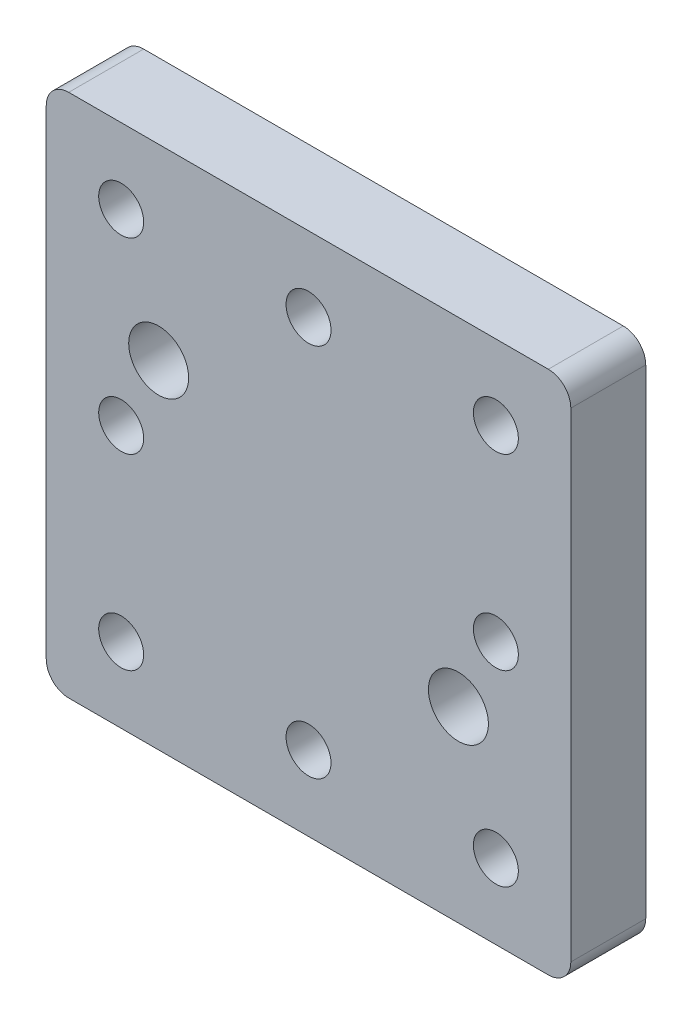
ISO-10303-21;
HEADER;
FILE_DESCRIPTION(('STEP AP214'),'2;1');
FILE_NAME('part.step','',(''),(''),'','','');
FILE_SCHEMA(('AUTOMOTIVE_DESIGN { 1 0 10303 214 1 1 1 1 }'));
ENDSEC;
DATA;
#1=APPLICATION_CONTEXT('core data for automotive mechanical design processes');
#2=APPLICATION_PROTOCOL_DEFINITION('international standard','automotive_design',2000,#1);
#3=PRODUCT_CONTEXT('',#1,'mechanical');
#4=PRODUCT('Part','Part','',(#3));
#5=PRODUCT_RELATED_PRODUCT_CATEGORY('part','',(#4));
#6=PRODUCT_DEFINITION_FORMATION('','',#4);
#7=PRODUCT_DEFINITION_CONTEXT('part definition',#1,'design');
#8=PRODUCT_DEFINITION('design','',#6,#7);
#9=PRODUCT_DEFINITION_SHAPE('','',#8);
#10=(LENGTH_UNIT() NAMED_UNIT(*) SI_UNIT(.MILLI.,.METRE.));
#11=(NAMED_UNIT(*) PLANE_ANGLE_UNIT() SI_UNIT($,.RADIAN.));
#12=(NAMED_UNIT(*) SI_UNIT($,.STERADIAN.) SOLID_ANGLE_UNIT());
#13=UNCERTAINTY_MEASURE_WITH_UNIT(LENGTH_MEASURE(1.E-05),#10,'distance_accuracy_value','');
#14=(GEOMETRIC_REPRESENTATION_CONTEXT(3) GLOBAL_UNCERTAINTY_ASSIGNED_CONTEXT((#13)) GLOBAL_UNIT_ASSIGNED_CONTEXT((#10,
#11,#12)) REPRESENTATION_CONTEXT('',''));
#15=CARTESIAN_POINT('',(0.,0.,0.));
#16=DIRECTION('',(0.,0.,1.));
#17=DIRECTION('',(1.,0.,0.));
#18=AXIS2_PLACEMENT_3D('',#15,#16,#17);
#19=CARTESIAN_POINT('',(35.,-35.,10.));
#20=DIRECTION('',(-1.,0.,0.));
#21=DIRECTION('',(0.,0.,1.));
#22=AXIS2_PLACEMENT_3D('',#19,#20,#21);
#23=PLANE('',#22);
#24=DIRECTION('',(0.,1.,0.));
#25=VECTOR('',#24,1.);
#26=CARTESIAN_POINT('',(35.,-35.,10.));
#27=LINE('',#26,#25);
#28=CARTESIAN_POINT('',(35.,-32.,10.));
#29=VERTEX_POINT('',#28);
#30=CARTESIAN_POINT('',(35.,32.,10.));
#31=VERTEX_POINT('',#30);
#32=EDGE_CURVE('E125',#29,#31,#27,.T.);
#33=ORIENTED_EDGE('',*,*,#32,.F.);
#34=DIRECTION('',(0.,0.,-1.));
#35=VECTOR('',#34,1.);
#36=CARTESIAN_POINT('',(35.,-32.,10.));
#37=LINE('',#36,#35);
#38=CARTESIAN_POINT('',(35.,-32.,0.));
#39=VERTEX_POINT('',#38);
#40=EDGE_CURVE('E151',#29,#39,#37,.T.);
#41=ORIENTED_EDGE('',*,*,#40,.T.);
#42=DIRECTION('',(0.,1.,0.));
#43=VECTOR('',#42,1.);
#44=CARTESIAN_POINT('',(35.,-35.,0.));
#45=LINE('',#44,#43);
#46=CARTESIAN_POINT('',(35.,32.,0.));
#47=VERTEX_POINT('',#46);
#48=EDGE_CURVE('E157',#39,#47,#45,.T.);
#49=ORIENTED_EDGE('',*,*,#48,.T.);
#50=DIRECTION('',(0.,0.,-1.));
#51=VECTOR('',#50,1.);
#52=CARTESIAN_POINT('',(35.,32.,10.));
#53=LINE('',#52,#51);
#54=EDGE_CURVE('E149',#47,#31,#53,.F.);
#55=ORIENTED_EDGE('',*,*,#54,.T.);
#56=EDGE_LOOP('',(#33,#41,#49,#55));
#57=FACE_BOUND('',#56,.T.);
#58=ADVANCED_FACE('F33',(#57),#23,.F.);
#59=CARTESIAN_POINT('',(-35.,35.,10.));
#60=DIRECTION('',(0.,-1.,0.));
#61=DIRECTION('',(0.,0.,-1.));
#62=AXIS2_PLACEMENT_3D('',#59,#60,#61);
#63=PLANE('',#62);
#64=DIRECTION('',(-1.,0.,0.));
#65=VECTOR('',#64,1.);
#66=CARTESIAN_POINT('',(-35.,35.,10.));
#67=LINE('',#66,#65);
#68=CARTESIAN_POINT('',(32.,35.,10.));
#69=VERTEX_POINT('',#68);
#70=CARTESIAN_POINT('',(-32.,35.,10.));
#71=VERTEX_POINT('',#70);
#72=EDGE_CURVE('E128',#69,#71,#67,.T.);
#73=ORIENTED_EDGE('',*,*,#72,.F.);
#74=DIRECTION('',(0.,0.,-1.));
#75=VECTOR('',#74,1.);
#76=CARTESIAN_POINT('',(32.,35.,10.));
#77=LINE('',#76,#75);
#78=CARTESIAN_POINT('',(32.,35.,0.));
#79=VERTEX_POINT('',#78);
#80=EDGE_CURVE('E11',#69,#79,#77,.T.);
#81=ORIENTED_EDGE('',*,*,#80,.T.);
#82=DIRECTION('',(-1.,0.,0.));
#83=VECTOR('',#82,1.);
#84=CARTESIAN_POINT('',(-35.,35.,0.));
#85=LINE('',#84,#83);
#86=CARTESIAN_POINT('',(-32.,35.,0.));
#87=VERTEX_POINT('',#86);
#88=EDGE_CURVE('E130',#79,#87,#85,.T.);
#89=ORIENTED_EDGE('',*,*,#88,.T.);
#90=DIRECTION('',(0.,0.,-1.));
#91=VECTOR('',#90,1.);
#92=CARTESIAN_POINT('',(-32.,35.,10.));
#93=LINE('',#92,#91);
#94=EDGE_CURVE('E41',#87,#71,#93,.F.);
#95=ORIENTED_EDGE('',*,*,#94,.T.);
#96=EDGE_LOOP('',(#73,#81,#89,#95));
#97=FACE_BOUND('',#96,.T.);
#98=ADVANCED_FACE('F276',(#97),#63,.F.);
#99=CARTESIAN_POINT('',(-35.,-35.,10.));
#100=DIRECTION('',(1.,0.,0.));
#101=DIRECTION('',(0.,0.,-1.));
#102=AXIS2_PLACEMENT_3D('',#99,#100,#101);
#103=PLANE('',#102);
#104=DIRECTION('',(0.,-1.,0.));
#105=VECTOR('',#104,1.);
#106=CARTESIAN_POINT('',(-35.,-35.,0.));
#107=LINE('',#106,#105);
#108=CARTESIAN_POINT('',(-35.,32.,0.));
#109=VERTEX_POINT('',#108);
#110=CARTESIAN_POINT('',(-35.,-32.,0.));
#111=VERTEX_POINT('',#110);
#112=EDGE_CURVE('E126',#109,#111,#107,.T.);
#113=ORIENTED_EDGE('',*,*,#112,.T.);
#114=DIRECTION('',(0.,0.,-1.));
#115=VECTOR('',#114,1.);
#116=CARTESIAN_POINT('',(-35.,-32.,10.));
#117=LINE('',#116,#115);
#118=CARTESIAN_POINT('',(-35.,-32.,10.));
#119=VERTEX_POINT('',#118);
#120=EDGE_CURVE('E104',#111,#119,#117,.F.);
#121=ORIENTED_EDGE('',*,*,#120,.T.);
#122=DIRECTION('',(0.,-1.,0.));
#123=VECTOR('',#122,1.);
#124=CARTESIAN_POINT('',(-35.,-35.,10.));
#125=LINE('',#124,#123);
#126=CARTESIAN_POINT('',(-35.,32.,10.));
#127=VERTEX_POINT('',#126);
#128=EDGE_CURVE('E169',#127,#119,#125,.T.);
#129=ORIENTED_EDGE('',*,*,#128,.F.);
#130=DIRECTION('',(0.,0.,-1.));
#131=VECTOR('',#130,1.);
#132=CARTESIAN_POINT('',(-35.,32.,10.));
#133=LINE('',#132,#131);
#134=EDGE_CURVE('E109',#127,#109,#133,.T.);
#135=ORIENTED_EDGE('',*,*,#134,.T.);
#136=EDGE_LOOP('',(#113,#121,#129,#135));
#137=FACE_BOUND('',#136,.T.);
#138=ADVANCED_FACE('F274',(#137),#103,.F.);
#139=CARTESIAN_POINT('',(-35.,-35.,10.));
#140=DIRECTION('',(0.,1.,0.));
#141=DIRECTION('',(0.,0.,1.));
#142=AXIS2_PLACEMENT_3D('',#139,#140,#141);
#143=PLANE('',#142);
#144=DIRECTION('',(1.,0.,0.));
#145=VECTOR('',#144,1.);
#146=CARTESIAN_POINT('',(-35.,-35.,10.));
#147=LINE('',#146,#145);
#148=CARTESIAN_POINT('',(-32.,-35.,10.));
#149=VERTEX_POINT('',#148);
#150=CARTESIAN_POINT('',(32.,-35.,10.));
#151=VERTEX_POINT('',#150);
#152=EDGE_CURVE('E119',#149,#151,#147,.T.);
#153=ORIENTED_EDGE('',*,*,#152,.F.);
#154=DIRECTION('',(0.,0.,-1.));
#155=VECTOR('',#154,1.);
#156=CARTESIAN_POINT('',(-32.,-35.,10.));
#157=LINE('',#156,#155);
#158=CARTESIAN_POINT('',(-32.,-35.,0.));
#159=VERTEX_POINT('',#158);
#160=EDGE_CURVE('E103',#149,#159,#157,.T.);
#161=ORIENTED_EDGE('',*,*,#160,.T.);
#162=DIRECTION('',(1.,0.,0.));
#163=VECTOR('',#162,1.);
#164=CARTESIAN_POINT('',(-35.,-35.,0.));
#165=LINE('',#164,#163);
#166=CARTESIAN_POINT('',(32.,-35.,0.));
#167=VERTEX_POINT('',#166);
#168=EDGE_CURVE('E116',#159,#167,#165,.T.);
#169=ORIENTED_EDGE('',*,*,#168,.T.);
#170=DIRECTION('',(0.,0.,-1.));
#171=VECTOR('',#170,1.);
#172=CARTESIAN_POINT('',(32.,-35.,10.));
#173=LINE('',#172,#171);
#174=EDGE_CURVE('E121',#167,#151,#173,.F.);
#175=ORIENTED_EDGE('',*,*,#174,.T.);
#176=EDGE_LOOP('',(#153,#161,#169,#175));
#177=FACE_BOUND('',#176,.T.);
#178=ADVANCED_FACE('F115',(#177),#143,.F.);
#179=CARTESIAN_POINT('',(0.,0.,10.));
#180=DIRECTION('',(0.,0.,-1.));
#181=DIRECTION('',(-1.,0.,0.));
#182=AXIS2_PLACEMENT_3D('',#179,#180,#181);
#183=PLANE('',#182);
#184=CARTESIAN_POINT('',(-20.,10.,10.));
#185=DIRECTION('',(0.,0.,-1.));
#186=DIRECTION('',(-1.,0.,0.));
#187=AXIS2_PLACEMENT_3D('',#184,#185,#186);
#188=CIRCLE('',#187,4.);
#189=CARTESIAN_POINT('',(-24.,10.,10.));
#190=VERTEX_POINT('',#189);
#191=EDGE_CURVE('E180',#190,#190,#188,.T.);
#192=ORIENTED_EDGE('',*,*,#191,.T.);
#193=EDGE_LOOP('',(#192));
#194=FACE_BOUND('',#193,.T.);
#195=CARTESIAN_POINT('',(20.,-10.,10.));
#196=DIRECTION('',(0.,0.,-1.));
#197=DIRECTION('',(-1.,0.,0.));
#198=AXIS2_PLACEMENT_3D('',#195,#196,#197);
#199=CIRCLE('',#198,4.);
#200=CARTESIAN_POINT('',(16.,-10.,10.));
#201=VERTEX_POINT('',#200);
#202=EDGE_CURVE('E218',#201,#201,#199,.T.);
#203=ORIENTED_EDGE('',*,*,#202,.T.);
#204=EDGE_LOOP('',(#203));
#205=FACE_BOUND('',#204,.T.);
#206=CARTESIAN_POINT('',(25.,-25.,10.));
#207=DIRECTION('',(0.,0.,1.));
#208=DIRECTION('',(1.,0.,0.));
#209=AXIS2_PLACEMENT_3D('',#206,#207,#208);
#210=CIRCLE('',#209,3.);
#211=CARTESIAN_POINT('',(28.,-25.,10.));
#212=VERTEX_POINT('',#211);
#213=EDGE_CURVE('E176',#212,#212,#210,.T.);
#214=ORIENTED_EDGE('',*,*,#213,.F.);
#215=EDGE_LOOP('',(#214));
#216=FACE_BOUND('',#215,.T.);
#217=CARTESIAN_POINT('',(0.,-25.,10.));
#218=DIRECTION('',(0.,0.,1.));
#219=DIRECTION('',(1.,0.,0.));
#220=AXIS2_PLACEMENT_3D('',#217,#218,#219);
#221=CIRCLE('',#220,3.);
#222=CARTESIAN_POINT('',(3.00000000000001,-25.,10.));
#223=VERTEX_POINT('',#222);
#224=EDGE_CURVE('E183',#223,#223,#221,.T.);
#225=ORIENTED_EDGE('',*,*,#224,.F.);
#226=EDGE_LOOP('',(#225));
#227=FACE_BOUND('',#226,.T.);
#228=CARTESIAN_POINT('',(-25.,-25.,10.));
#229=DIRECTION('',(0.,0.,1.));
#230=DIRECTION('',(1.,0.,0.));
#231=AXIS2_PLACEMENT_3D('',#228,#229,#230);
#232=CIRCLE('',#231,3.);
#233=CARTESIAN_POINT('',(-22.,-25.,10.));
#234=VERTEX_POINT('',#233);
#235=EDGE_CURVE('E189',#234,#234,#232,.T.);
#236=ORIENTED_EDGE('',*,*,#235,.F.);
#237=EDGE_LOOP('',(#236));
#238=FACE_BOUND('',#237,.T.);
#239=CARTESIAN_POINT('',(-25.,25.,10.));
#240=DIRECTION('',(0.,0.,1.));
#241=DIRECTION('',(1.,0.,0.));
#242=AXIS2_PLACEMENT_3D('',#239,#240,#241);
#243=CIRCLE('',#242,3.);
#244=CARTESIAN_POINT('',(-22.,25.,10.));
#245=VERTEX_POINT('',#244);
#246=EDGE_CURVE('E195',#245,#245,#243,.T.);
#247=ORIENTED_EDGE('',*,*,#246,.F.);
#248=EDGE_LOOP('',(#247));
#249=FACE_BOUND('',#248,.T.);
#250=CARTESIAN_POINT('',(-25.,0.,10.));
#251=DIRECTION('',(0.,0.,1.));
#252=DIRECTION('',(1.,0.,0.));
#253=AXIS2_PLACEMENT_3D('',#250,#251,#252);
#254=CIRCLE('',#253,3.);
#255=CARTESIAN_POINT('',(-22.,0.,10.));
#256=VERTEX_POINT('',#255);
#257=EDGE_CURVE('E201',#256,#256,#254,.T.);
#258=ORIENTED_EDGE('',*,*,#257,.F.);
#259=EDGE_LOOP('',(#258));
#260=FACE_BOUND('',#259,.T.);
#261=CARTESIAN_POINT('',(25.,0.,10.));
#262=DIRECTION('',(0.,0.,1.));
#263=DIRECTION('',(1.,0.,0.));
#264=AXIS2_PLACEMENT_3D('',#261,#262,#263);
#265=CIRCLE('',#264,3.);
#266=CARTESIAN_POINT('',(28.,0.,10.));
#267=VERTEX_POINT('',#266);
#268=EDGE_CURVE('E207',#267,#267,#265,.T.);
#269=ORIENTED_EDGE('',*,*,#268,.F.);
#270=EDGE_LOOP('',(#269));
#271=FACE_BOUND('',#270,.T.);
#272=CARTESIAN_POINT('',(25.,25.,10.));
#273=DIRECTION('',(0.,0.,1.));
#274=DIRECTION('',(1.,0.,0.));
#275=AXIS2_PLACEMENT_3D('',#272,#273,#274);
#276=CIRCLE('',#275,3.);
#277=CARTESIAN_POINT('',(28.,25.,10.));
#278=VERTEX_POINT('',#277);
#279=EDGE_CURVE('E213',#278,#278,#276,.T.);
#280=ORIENTED_EDGE('',*,*,#279,.F.);
#281=EDGE_LOOP('',(#280));
#282=FACE_BOUND('',#281,.T.);
#283=CARTESIAN_POINT('',(0.,25.,10.));
#284=DIRECTION('',(0.,0.,1.));
#285=DIRECTION('',(1.,0.,0.));
#286=AXIS2_PLACEMENT_3D('',#283,#284,#285);
#287=CIRCLE('',#286,3.);
#288=CARTESIAN_POINT('',(3.00000000000001,25.,10.));
#289=VERTEX_POINT('',#288);
#290=EDGE_CURVE('E165',#289,#289,#287,.T.);
#291=ORIENTED_EDGE('',*,*,#290,.F.);
#292=EDGE_LOOP('',(#291));
#293=FACE_BOUND('',#292,.T.);
#294=ORIENTED_EDGE('',*,*,#128,.T.);
#295=CARTESIAN_POINT('',(-32.,-32.,10.));
#296=DIRECTION('',(0.,0.,-1.));
#297=DIRECTION('',(-1.,0.,0.));
#298=AXIS2_PLACEMENT_3D('',#295,#296,#297);
#299=CIRCLE('',#298,3.);
#300=EDGE_CURVE('E147',#119,#149,#299,.F.);
#301=ORIENTED_EDGE('',*,*,#300,.T.);
#302=ORIENTED_EDGE('',*,*,#152,.T.);
#303=CARTESIAN_POINT('',(32.,-32.,10.));
#304=DIRECTION('',(0.,0.,-1.));
#305=DIRECTION('',(-1.,0.,0.));
#306=AXIS2_PLACEMENT_3D('',#303,#304,#305);
#307=CIRCLE('',#306,3.);
#308=EDGE_CURVE('E145',#151,#29,#307,.F.);
#309=ORIENTED_EDGE('',*,*,#308,.T.);
#310=ORIENTED_EDGE('',*,*,#32,.T.);
#311=CARTESIAN_POINT('',(32.,32.,10.));
#312=DIRECTION('',(0.,0.,-1.));
#313=DIRECTION('',(-1.,0.,0.));
#314=AXIS2_PLACEMENT_3D('',#311,#312,#313);
#315=CIRCLE('',#314,3.);
#316=EDGE_CURVE('E54',#31,#69,#315,.F.);
#317=ORIENTED_EDGE('',*,*,#316,.T.);
#318=ORIENTED_EDGE('',*,*,#72,.T.);
#319=CARTESIAN_POINT('',(-32.,32.,10.));
#320=DIRECTION('',(0.,0.,-1.));
#321=DIRECTION('',(-1.,0.,0.));
#322=AXIS2_PLACEMENT_3D('',#319,#320,#321);
#323=CIRCLE('',#322,3.);
#324=EDGE_CURVE('E142',#71,#127,#323,.F.);
#325=ORIENTED_EDGE('',*,*,#324,.T.);
#326=EDGE_LOOP('',(#294,#301,#302,#309,#310,#317,#318,#325));
#327=FACE_BOUND('',#326,.T.);
#328=ADVANCED_FACE('F230',(#194,#205,#216,#227,#238,#249,#260,#271,#282,#293,#327),#183,.F.);
#329=CARTESIAN_POINT('',(0.,0.,0.));
#330=DIRECTION('',(0.,0.,-1.));
#331=DIRECTION('',(-1.,0.,0.));
#332=AXIS2_PLACEMENT_3D('',#329,#330,#331);
#333=PLANE('',#332);
#334=CARTESIAN_POINT('',(-20.,10.,0.));
#335=DIRECTION('',(0.,0.,-1.));
#336=DIRECTION('',(-1.,0.,0.));
#337=AXIS2_PLACEMENT_3D('',#334,#335,#336);
#338=CIRCLE('',#337,4.);
#339=CARTESIAN_POINT('',(-24.,10.,0.));
#340=VERTEX_POINT('',#339);
#341=EDGE_CURVE('E224',#340,#340,#338,.T.);
#342=ORIENTED_EDGE('',*,*,#341,.F.);
#343=EDGE_LOOP('',(#342));
#344=FACE_BOUND('',#343,.T.);
#345=CARTESIAN_POINT('',(20.,-10.,0.));
#346=DIRECTION('',(0.,0.,-1.));
#347=DIRECTION('',(-1.,0.,0.));
#348=AXIS2_PLACEMENT_3D('',#345,#346,#347);
#349=CIRCLE('',#348,4.);
#350=CARTESIAN_POINT('',(16.,-10.,0.));
#351=VERTEX_POINT('',#350);
#352=EDGE_CURVE('E221',#351,#351,#349,.T.);
#353=ORIENTED_EDGE('',*,*,#352,.F.);
#354=EDGE_LOOP('',(#353));
#355=FACE_BOUND('',#354,.T.);
#356=CARTESIAN_POINT('',(25.,-25.,0.));
#357=DIRECTION('',(0.,0.,1.));
#358=DIRECTION('',(1.,0.,0.));
#359=AXIS2_PLACEMENT_3D('',#356,#357,#358);
#360=CIRCLE('',#359,3.);
#361=CARTESIAN_POINT('',(28.,-25.,0.));
#362=VERTEX_POINT('',#361);
#363=EDGE_CURVE('E179',#362,#362,#360,.T.);
#364=ORIENTED_EDGE('',*,*,#363,.T.);
#365=EDGE_LOOP('',(#364));
#366=FACE_BOUND('',#365,.T.);
#367=CARTESIAN_POINT('',(0.,-25.,0.));
#368=DIRECTION('',(0.,0.,1.));
#369=DIRECTION('',(1.,0.,0.));
#370=AXIS2_PLACEMENT_3D('',#367,#368,#369);
#371=CIRCLE('',#370,3.);
#372=CARTESIAN_POINT('',(3.00000000000001,-25.,0.));
#373=VERTEX_POINT('',#372);
#374=EDGE_CURVE('E186',#373,#373,#371,.T.);
#375=ORIENTED_EDGE('',*,*,#374,.T.);
#376=EDGE_LOOP('',(#375));
#377=FACE_BOUND('',#376,.T.);
#378=CARTESIAN_POINT('',(-25.,-25.,0.));
#379=DIRECTION('',(0.,0.,1.));
#380=DIRECTION('',(1.,0.,0.));
#381=AXIS2_PLACEMENT_3D('',#378,#379,#380);
#382=CIRCLE('',#381,3.);
#383=CARTESIAN_POINT('',(-22.,-25.,0.));
#384=VERTEX_POINT('',#383);
#385=EDGE_CURVE('E192',#384,#384,#382,.T.);
#386=ORIENTED_EDGE('',*,*,#385,.T.);
#387=EDGE_LOOP('',(#386));
#388=FACE_BOUND('',#387,.T.);
#389=CARTESIAN_POINT('',(-25.,25.,0.));
#390=DIRECTION('',(0.,0.,1.));
#391=DIRECTION('',(1.,0.,0.));
#392=AXIS2_PLACEMENT_3D('',#389,#390,#391);
#393=CIRCLE('',#392,3.);
#394=CARTESIAN_POINT('',(-22.,25.,0.));
#395=VERTEX_POINT('',#394);
#396=EDGE_CURVE('E198',#395,#395,#393,.T.);
#397=ORIENTED_EDGE('',*,*,#396,.T.);
#398=EDGE_LOOP('',(#397));
#399=FACE_BOUND('',#398,.T.);
#400=CARTESIAN_POINT('',(-25.,0.,0.));
#401=DIRECTION('',(0.,0.,1.));
#402=DIRECTION('',(1.,0.,0.));
#403=AXIS2_PLACEMENT_3D('',#400,#401,#402);
#404=CIRCLE('',#403,3.);
#405=CARTESIAN_POINT('',(-22.,0.,0.));
#406=VERTEX_POINT('',#405);
#407=EDGE_CURVE('E204',#406,#406,#404,.T.);
#408=ORIENTED_EDGE('',*,*,#407,.T.);
#409=EDGE_LOOP('',(#408));
#410=FACE_BOUND('',#409,.T.);
#411=CARTESIAN_POINT('',(25.,0.,0.));
#412=DIRECTION('',(0.,0.,1.));
#413=DIRECTION('',(1.,0.,0.));
#414=AXIS2_PLACEMENT_3D('',#411,#412,#413);
#415=CIRCLE('',#414,3.);
#416=CARTESIAN_POINT('',(28.,0.,0.));
#417=VERTEX_POINT('',#416);
#418=EDGE_CURVE('E210',#417,#417,#415,.T.);
#419=ORIENTED_EDGE('',*,*,#418,.T.);
#420=EDGE_LOOP('',(#419));
#421=FACE_BOUND('',#420,.T.);
#422=CARTESIAN_POINT('',(25.,25.,0.));
#423=DIRECTION('',(0.,0.,1.));
#424=DIRECTION('',(1.,0.,0.));
#425=AXIS2_PLACEMENT_3D('',#422,#423,#424);
#426=CIRCLE('',#425,3.);
#427=CARTESIAN_POINT('',(28.,25.,0.));
#428=VERTEX_POINT('',#427);
#429=EDGE_CURVE('E174',#428,#428,#426,.T.);
#430=ORIENTED_EDGE('',*,*,#429,.T.);
#431=EDGE_LOOP('',(#430));
#432=FACE_BOUND('',#431,.T.);
#433=CARTESIAN_POINT('',(0.,25.,0.));
#434=DIRECTION('',(0.,0.,1.));
#435=DIRECTION('',(1.,0.,0.));
#436=AXIS2_PLACEMENT_3D('',#433,#434,#435);
#437=CIRCLE('',#436,3.);
#438=CARTESIAN_POINT('',(3.00000000000001,25.,0.));
#439=VERTEX_POINT('',#438);
#440=EDGE_CURVE('E162',#439,#439,#437,.T.);
#441=ORIENTED_EDGE('',*,*,#440,.T.);
#442=EDGE_LOOP('',(#441));
#443=FACE_BOUND('',#442,.T.);
#444=ORIENTED_EDGE('',*,*,#168,.F.);
#445=CARTESIAN_POINT('',(-32.,-32.,0.));
#446=DIRECTION('',(0.,0.,-1.));
#447=DIRECTION('',(-1.,0.,0.));
#448=AXIS2_PLACEMENT_3D('',#445,#446,#447);
#449=CIRCLE('',#448,3.);
#450=EDGE_CURVE('E99',#159,#111,#449,.T.);
#451=ORIENTED_EDGE('',*,*,#450,.T.);
#452=ORIENTED_EDGE('',*,*,#112,.F.);
#453=CARTESIAN_POINT('',(-32.,32.,0.));
#454=DIRECTION('',(0.,0.,-1.));
#455=DIRECTION('',(-1.,0.,0.));
#456=AXIS2_PLACEMENT_3D('',#453,#454,#455);
#457=CIRCLE('',#456,3.);
#458=EDGE_CURVE('E120',#109,#87,#457,.T.);
#459=ORIENTED_EDGE('',*,*,#458,.T.);
#460=ORIENTED_EDGE('',*,*,#88,.F.);
#461=CARTESIAN_POINT('',(32.,32.,0.));
#462=DIRECTION('',(0.,0.,-1.));
#463=DIRECTION('',(-1.,0.,0.));
#464=AXIS2_PLACEMENT_3D('',#461,#462,#463);
#465=CIRCLE('',#464,3.);
#466=EDGE_CURVE('E136',#79,#47,#465,.T.);
#467=ORIENTED_EDGE('',*,*,#466,.T.);
#468=ORIENTED_EDGE('',*,*,#48,.F.);
#469=CARTESIAN_POINT('',(32.,-32.,0.));
#470=DIRECTION('',(0.,0.,-1.));
#471=DIRECTION('',(-1.,0.,0.));
#472=AXIS2_PLACEMENT_3D('',#469,#470,#471);
#473=CIRCLE('',#472,3.);
#474=EDGE_CURVE('E110',#39,#167,#473,.T.);
#475=ORIENTED_EDGE('',*,*,#474,.T.);
#476=EDGE_LOOP('',(#444,#451,#452,#459,#460,#467,#468,#475));
#477=FACE_BOUND('',#476,.T.);
#478=ADVANCED_FACE('F123',(#344,#355,#366,#377,#388,#399,#410,#421,#432,#443,#477),#333,.T.);
#479=CARTESIAN_POINT('',(0.,25.,0.));
#480=DIRECTION('',(0.,0.,1.));
#481=DIRECTION('',(1.,0.,0.));
#482=AXIS2_PLACEMENT_3D('',#479,#480,#481);
#483=CYLINDRICAL_SURFACE('',#482,3.);
#484=ORIENTED_EDGE('',*,*,#440,.F.);
#485=EDGE_LOOP('',(#484));
#486=FACE_BOUND('',#485,.T.);
#487=ORIENTED_EDGE('',*,*,#290,.T.);
#488=EDGE_LOOP('',(#487));
#489=FACE_BOUND('',#488,.T.);
#490=ADVANCED_FACE('F242',(#486,#489),#483,.F.);
#491=CARTESIAN_POINT('',(25.,25.,0.));
#492=DIRECTION('',(0.,0.,1.));
#493=DIRECTION('',(1.,0.,0.));
#494=AXIS2_PLACEMENT_3D('',#491,#492,#493);
#495=CYLINDRICAL_SURFACE('',#494,3.);
#496=ORIENTED_EDGE('',*,*,#429,.F.);
#497=EDGE_LOOP('',(#496));
#498=FACE_BOUND('',#497,.T.);
#499=ORIENTED_EDGE('',*,*,#279,.T.);
#500=EDGE_LOOP('',(#499));
#501=FACE_BOUND('',#500,.T.);
#502=ADVANCED_FACE('F264',(#498,#501),#495,.F.);
#503=CARTESIAN_POINT('',(25.,0.,0.));
#504=DIRECTION('',(0.,0.,1.));
#505=DIRECTION('',(1.,0.,0.));
#506=AXIS2_PLACEMENT_3D('',#503,#504,#505);
#507=CYLINDRICAL_SURFACE('',#506,3.);
#508=ORIENTED_EDGE('',*,*,#418,.F.);
#509=EDGE_LOOP('',(#508));
#510=FACE_BOUND('',#509,.T.);
#511=ORIENTED_EDGE('',*,*,#268,.T.);
#512=EDGE_LOOP('',(#511));
#513=FACE_BOUND('',#512,.T.);
#514=ADVANCED_FACE('F319',(#510,#513),#507,.F.);
#515=CARTESIAN_POINT('',(-25.,0.,0.));
#516=DIRECTION('',(0.,0.,1.));
#517=DIRECTION('',(1.,0.,0.));
#518=AXIS2_PLACEMENT_3D('',#515,#516,#517);
#519=CYLINDRICAL_SURFACE('',#518,3.);
#520=ORIENTED_EDGE('',*,*,#407,.F.);
#521=EDGE_LOOP('',(#520));
#522=FACE_BOUND('',#521,.T.);
#523=ORIENTED_EDGE('',*,*,#257,.T.);
#524=EDGE_LOOP('',(#523));
#525=FACE_BOUND('',#524,.T.);
#526=ADVANCED_FACE('F315',(#522,#525),#519,.F.);
#527=CARTESIAN_POINT('',(-25.,25.,0.));
#528=DIRECTION('',(0.,0.,1.));
#529=DIRECTION('',(1.,0.,0.));
#530=AXIS2_PLACEMENT_3D('',#527,#528,#529);
#531=CYLINDRICAL_SURFACE('',#530,3.);
#532=ORIENTED_EDGE('',*,*,#396,.F.);
#533=EDGE_LOOP('',(#532));
#534=FACE_BOUND('',#533,.T.);
#535=ORIENTED_EDGE('',*,*,#246,.T.);
#536=EDGE_LOOP('',(#535));
#537=FACE_BOUND('',#536,.T.);
#538=ADVANCED_FACE('F311',(#534,#537),#531,.F.);
#539=CARTESIAN_POINT('',(-25.,-25.,0.));
#540=DIRECTION('',(0.,0.,1.));
#541=DIRECTION('',(1.,0.,0.));
#542=AXIS2_PLACEMENT_3D('',#539,#540,#541);
#543=CYLINDRICAL_SURFACE('',#542,3.);
#544=ORIENTED_EDGE('',*,*,#385,.F.);
#545=EDGE_LOOP('',(#544));
#546=FACE_BOUND('',#545,.T.);
#547=ORIENTED_EDGE('',*,*,#235,.T.);
#548=EDGE_LOOP('',(#547));
#549=FACE_BOUND('',#548,.T.);
#550=ADVANCED_FACE('F307',(#546,#549),#543,.F.);
#551=CARTESIAN_POINT('',(0.,-25.,0.));
#552=DIRECTION('',(0.,0.,1.));
#553=DIRECTION('',(1.,0.,0.));
#554=AXIS2_PLACEMENT_3D('',#551,#552,#553);
#555=CYLINDRICAL_SURFACE('',#554,3.);
#556=ORIENTED_EDGE('',*,*,#374,.F.);
#557=EDGE_LOOP('',(#556));
#558=FACE_BOUND('',#557,.T.);
#559=ORIENTED_EDGE('',*,*,#224,.T.);
#560=EDGE_LOOP('',(#559));
#561=FACE_BOUND('',#560,.T.);
#562=ADVANCED_FACE('F303',(#558,#561),#555,.F.);
#563=CARTESIAN_POINT('',(25.,-25.,0.));
#564=DIRECTION('',(0.,0.,1.));
#565=DIRECTION('',(1.,0.,0.));
#566=AXIS2_PLACEMENT_3D('',#563,#564,#565);
#567=CYLINDRICAL_SURFACE('',#566,3.);
#568=ORIENTED_EDGE('',*,*,#363,.F.);
#569=EDGE_LOOP('',(#568));
#570=FACE_BOUND('',#569,.T.);
#571=ORIENTED_EDGE('',*,*,#213,.T.);
#572=EDGE_LOOP('',(#571));
#573=FACE_BOUND('',#572,.T.);
#574=ADVANCED_FACE('F287',(#570,#573),#567,.F.);
#575=CARTESIAN_POINT('',(-32.,-32.,10.));
#576=DIRECTION('',(0.,0.,-1.));
#577=DIRECTION('',(-1.,0.,0.));
#578=AXIS2_PLACEMENT_3D('',#575,#576,#577);
#579=CYLINDRICAL_SURFACE('',#578,3.);
#580=ORIENTED_EDGE('',*,*,#300,.F.);
#581=ORIENTED_EDGE('',*,*,#120,.F.);
#582=ORIENTED_EDGE('',*,*,#450,.F.);
#583=ORIENTED_EDGE('',*,*,#160,.F.);
#584=EDGE_LOOP('',(#580,#581,#582,#583));
#585=FACE_BOUND('',#584,.T.);
#586=ADVANCED_FACE('F102',(#585),#579,.T.);
#587=CARTESIAN_POINT('',(32.,-32.,10.));
#588=DIRECTION('',(0.,0.,-1.));
#589=DIRECTION('',(-1.,0.,0.));
#590=AXIS2_PLACEMENT_3D('',#587,#588,#589);
#591=CYLINDRICAL_SURFACE('',#590,3.);
#592=ORIENTED_EDGE('',*,*,#308,.F.);
#593=ORIENTED_EDGE('',*,*,#174,.F.);
#594=ORIENTED_EDGE('',*,*,#474,.F.);
#595=ORIENTED_EDGE('',*,*,#40,.F.);
#596=EDGE_LOOP('',(#592,#593,#594,#595));
#597=FACE_BOUND('',#596,.T.);
#598=ADVANCED_FACE('F280',(#597),#591,.T.);
#599=CARTESIAN_POINT('',(32.,32.,10.));
#600=DIRECTION('',(0.,0.,-1.));
#601=DIRECTION('',(-1.,0.,0.));
#602=AXIS2_PLACEMENT_3D('',#599,#600,#601);
#603=CYLINDRICAL_SURFACE('',#602,3.);
#604=ORIENTED_EDGE('',*,*,#316,.F.);
#605=ORIENTED_EDGE('',*,*,#54,.F.);
#606=ORIENTED_EDGE('',*,*,#466,.F.);
#607=ORIENTED_EDGE('',*,*,#80,.F.);
#608=EDGE_LOOP('',(#604,#605,#606,#607));
#609=FACE_BOUND('',#608,.T.);
#610=ADVANCED_FACE('F279',(#609),#603,.T.);
#611=CARTESIAN_POINT('',(-32.,32.,10.));
#612=DIRECTION('',(0.,0.,-1.));
#613=DIRECTION('',(-1.,0.,0.));
#614=AXIS2_PLACEMENT_3D('',#611,#612,#613);
#615=CYLINDRICAL_SURFACE('',#614,3.);
#616=ORIENTED_EDGE('',*,*,#324,.F.);
#617=ORIENTED_EDGE('',*,*,#94,.F.);
#618=ORIENTED_EDGE('',*,*,#458,.F.);
#619=ORIENTED_EDGE('',*,*,#134,.F.);
#620=EDGE_LOOP('',(#616,#617,#618,#619));
#621=FACE_BOUND('',#620,.T.);
#622=ADVANCED_FACE('F35',(#621),#615,.T.);
#623=CARTESIAN_POINT('',(20.,-10.,10.));
#624=DIRECTION('',(0.,0.,-1.));
#625=DIRECTION('',(-1.,0.,0.));
#626=AXIS2_PLACEMENT_3D('',#623,#624,#625);
#627=CYLINDRICAL_SURFACE('',#626,4.);
#628=ORIENTED_EDGE('',*,*,#202,.F.);
#629=EDGE_LOOP('',(#628));
#630=FACE_BOUND('',#629,.T.);
#631=ORIENTED_EDGE('',*,*,#352,.T.);
#632=EDGE_LOOP('',(#631));
#633=FACE_BOUND('',#632,.T.);
#634=ADVANCED_FACE('F236',(#630,#633),#627,.F.);
#635=CARTESIAN_POINT('',(-20.,10.,10.));
#636=DIRECTION('',(0.,0.,-1.));
#637=DIRECTION('',(-1.,0.,0.));
#638=AXIS2_PLACEMENT_3D('',#635,#636,#637);
#639=CYLINDRICAL_SURFACE('',#638,4.);
#640=ORIENTED_EDGE('',*,*,#191,.F.);
#641=EDGE_LOOP('',(#640));
#642=FACE_BOUND('',#641,.T.);
#643=ORIENTED_EDGE('',*,*,#341,.T.);
#644=EDGE_LOOP('',(#643));
#645=FACE_BOUND('',#644,.T.);
#646=ADVANCED_FACE('F233',(#642,#645),#639,.F.);
#647=CLOSED_SHELL('',(#58,#98,#138,#178,#328,#478,#490,#502,#514,#526,#538,#550,#562,#574,#586,
#598,#610,#622,#634,#646));
#648=MANIFOLD_SOLID_BREP('B2',#647);
#649=ADVANCED_BREP_SHAPE_REPRESENTATION('',(#18,#648),#14);
#650=SHAPE_DEFINITION_REPRESENTATION(#9,#649);
ENDSEC;
END-ISO-10303-21;
